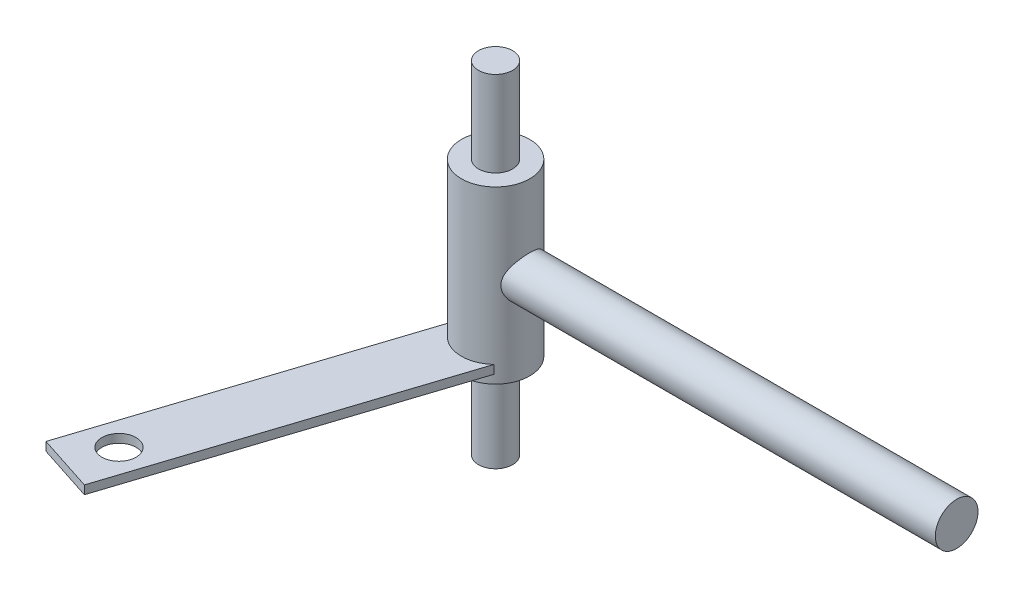
ISO-10303-21;
HEADER;
FILE_DESCRIPTION(('STEP AP214'),'2;1');
FILE_NAME('part.step','',(''),(''),'','','');
FILE_SCHEMA(('AUTOMOTIVE_DESIGN { 1 0 10303 214 1 1 1 1 }'));
ENDSEC;
DATA;
#1=APPLICATION_CONTEXT('core data for automotive mechanical design processes');
#2=APPLICATION_PROTOCOL_DEFINITION('international standard','automotive_design',2000,#1);
#3=PRODUCT_CONTEXT('',#1,'mechanical');
#4=PRODUCT('Part','Part','',(#3));
#5=PRODUCT_RELATED_PRODUCT_CATEGORY('part','',(#4));
#6=PRODUCT_DEFINITION_FORMATION('','',#4);
#7=PRODUCT_DEFINITION_CONTEXT('part definition',#1,'design');
#8=PRODUCT_DEFINITION('design','',#6,#7);
#9=PRODUCT_DEFINITION_SHAPE('','',#8);
#10=(LENGTH_UNIT() NAMED_UNIT(*) SI_UNIT(.MILLI.,.METRE.));
#11=(NAMED_UNIT(*) PLANE_ANGLE_UNIT() SI_UNIT($,.RADIAN.));
#12=(NAMED_UNIT(*) SI_UNIT($,.STERADIAN.) SOLID_ANGLE_UNIT());
#13=UNCERTAINTY_MEASURE_WITH_UNIT(LENGTH_MEASURE(1.E-05),#10,'distance_accuracy_value','');
#14=(GEOMETRIC_REPRESENTATION_CONTEXT(3) GLOBAL_UNCERTAINTY_ASSIGNED_CONTEXT((#13)) GLOBAL_UNIT_ASSIGNED_CONTEXT((#10,
#11,#12)) REPRESENTATION_CONTEXT('',''));
#15=CARTESIAN_POINT('',(0.,0.,0.));
#16=DIRECTION('',(0.,0.,1.));
#17=DIRECTION('',(1.,0.,0.));
#18=AXIS2_PLACEMENT_3D('',#15,#16,#17);
#19=CARTESIAN_POINT('',(0.,20.,0.));
#20=DIRECTION('',(0.,-1.,0.));
#21=DIRECTION('',(0.,0.,-1.));
#22=AXIS2_PLACEMENT_3D('',#19,#20,#21);
#23=CYLINDRICAL_SURFACE('',#22,8.);
#24=CARTESIAN_POINT('',(6.2449979983984,0.,5.));
#25=CARTESIAN_POINT('',(6.24499999083318,-0.124309997084916,4.99999874728376));
#26=CARTESIAN_POINT('',(6.24872594235153,-0.248643911922182,4.99535477639502));
#27=CARTESIAN_POINT('',(6.26346233698878,-0.49624234521784,4.97686385741702));
#28=CARTESIAN_POINT('',(6.27447707053879,-0.619506190474289,4.96301148892208));
#29=CARTESIAN_POINT('',(6.30332817855701,-0.864132894108489,4.92631685582622));
#30=CARTESIAN_POINT('',(6.32117831167981,-0.985491401070756,4.90345645667282));
#31=CARTESIAN_POINT('',(6.36295500797281,-1.22521846002732,4.84912073775945));
#32=CARTESIAN_POINT('',(6.38688460836052,-1.34358548492504,4.81764111134031));
#33=CARTESIAN_POINT('',(6.46598710467671,-1.69098285176997,4.7115563432738));
#34=CARTESIAN_POINT('',(6.52878844336903,-1.91472159134201,4.6249307188155));
#35=CARTESIAN_POINT('',(6.66732308206754,-2.34407629105235,4.42286683667302));
#36=CARTESIAN_POINT('',(6.74305673480881,-2.54969175663766,4.30742779304936));
#37=CARTESIAN_POINT('',(6.91118002626909,-2.9674414130167,4.03296948836377));
#38=CARTESIAN_POINT('',(7.00444112628932,-3.17674952950574,3.87018134056582));
#39=CARTESIAN_POINT('',(7.19012524520994,-3.5675602565304,3.51319765959103));
#40=CARTESIAN_POINT('',(7.28254746874407,-3.74903864049325,3.31897506071619));
#41=CARTESIAN_POINT('',(7.41988971846401,-4.00760626149244,2.99356128179164));
#42=CARTESIAN_POINT('',(7.46785190700925,-4.09554829341698,2.87212880091628));
#43=CARTESIAN_POINT('',(7.55971876275306,-4.2607595171728,2.62078661715024));
#44=CARTESIAN_POINT('',(7.60362512973126,-4.33803318685166,2.49088050482952));
#45=CARTESIAN_POINT('',(7.68611478127736,-4.48104536831486,2.22333771815377));
#46=CARTESIAN_POINT('',(7.72470066932016,-4.54678952615798,2.08570487145723));
#47=CARTESIAN_POINT('',(7.79539753077303,-4.66588913640084,1.80358193532003));
#48=CARTESIAN_POINT('',(7.82750968154027,-4.71924684175159,1.6590930986712));
#49=CARTESIAN_POINT('',(7.88132879110577,-4.8079574186921,1.37943032429723));
#50=CARTESIAN_POINT('',(7.90376135583819,-4.84458864196752,1.24480106420069));
#51=CARTESIAN_POINT('',(7.94191844310852,-4.90659427549434,0.972050692903698));
#52=CARTESIAN_POINT('',(7.95764407963578,-4.93197055516711,0.833930165626438));
#53=CARTESIAN_POINT('',(7.98191012055643,-4.97102838824165,0.555534462309618));
#54=CARTESIAN_POINT('',(7.9904564434862,-4.98471957483722,0.415261158337185));
#55=CARTESIAN_POINT('',(8.00011955525847,-5.00019508535282,0.133810084943768));
#56=CARTESIAN_POINT('',(8.00123719925945,-5.00198077978344,-0.00736757849820934));
#57=CARTESIAN_POINT('',(7.99636544353032,-4.99418306842006,-0.270239609899376));
#58=CARTESIAN_POINT('',(7.99131217584322,-4.9860972278415,-0.391999310072934));
#59=CARTESIAN_POINT('',(7.97573898833036,-4.96109950689231,-0.63429359230614));
#60=CARTESIAN_POINT('',(7.96521743178982,-4.94418498400023,-0.754827796543429));
#61=CARTESIAN_POINT('',(7.93894787928476,-4.90175195667388,-0.9937504162903));
#62=CARTESIAN_POINT('',(7.92320165200919,-4.8762363638823,-1.11213954368103));
#63=CARTESIAN_POINT('',(7.88683283084566,-4.81691536004192,-1.34607315554106));
#64=CARTESIAN_POINT('',(7.86620835217571,-4.78310674467799,-1.46161652141072));
#65=CARTESIAN_POINT('',(7.79753837345255,-4.66961406787293,-1.80341623892686));
#66=CARTESIAN_POINT('',(7.74273886956257,-4.57793007291278,-2.02447250488061));
#67=CARTESIAN_POINT('',(7.6194209119633,-4.36611560771666,-2.44811588786114));
#68=CARTESIAN_POINT('',(7.55089933332867,-4.24597865675437,-2.6506987826293));
#69=CARTESIAN_POINT('',(7.39573414184525,-3.96389668023518,-3.05883635403528));
#70=CARTESIAN_POINT('',(7.30789649394851,-3.79860933546551,-3.26162345770391));
#71=CARTESIAN_POINT('',(7.12780216070677,-3.43944259665051,-3.63842034253163));
#72=CARTESIAN_POINT('',(7.0355391870356,-3.24552165003414,-3.81238750882611));
#73=CARTESIAN_POINT('',(6.89398778931581,-2.92199806035766,-4.05999923159469));
#74=CARTESIAN_POINT('',(6.84343529038729,-2.80103153254676,-4.14440430037547));
#75=CARTESIAN_POINT('',(6.7450499014227,-2.5512511400869,-4.30267035241461));
#76=CARTESIAN_POINT('',(6.69721752335299,-2.42243580756731,-4.37652935467605));
#77=CARTESIAN_POINT('',(6.60608014442446,-2.15770926568204,-4.51291782494085));
#78=CARTESIAN_POINT('',(6.56276754252838,-2.02181056536115,-4.57546644816391));
#79=CARTESIAN_POINT('',(6.48238923774268,-1.74330768244433,-4.6886516739402));
#80=CARTESIAN_POINT('',(6.44532349757936,-1.60070353986484,-4.7392883475702));
#81=CARTESIAN_POINT('',(6.3879911088914,-1.34808415551627,-4.81614194168603));
#82=CARTESIAN_POINT('',(6.36587062744548,-1.23937010533179,-4.84527833481626));
#83=CARTESIAN_POINT('',(6.3267200135842,-1.01935900201234,-4.89628944573215));
#84=CARTESIAN_POINT('',(6.30968872571675,-0.908062541381968,-4.91816581196151));
#85=CARTESIAN_POINT('',(6.2813224765214,-0.683654493148006,-4.95434333722363));
#86=CARTESIAN_POINT('',(6.26998098512218,-0.570545140796211,-4.96865318123363));
#87=CARTESIAN_POINT('',(6.25339132178237,-0.343158274667134,-4.98951663397229));
#88=CARTESIAN_POINT('',(6.24814339794355,-0.228880713516906,-4.99606992689043));
#89=CARTESIAN_POINT('',(6.24394563972607,0.000213756327469843,-5.00131530513999));
#90=CARTESIAN_POINT('',(6.2450091194138,0.115031294285455,-4.99999077198392));
#91=CARTESIAN_POINT('',(6.25342323341975,0.34411058983996,-4.98946310366481));
#92=CARTESIAN_POINT('',(6.26077617711313,0.458372127783275,-4.98025707456074));
#93=CARTESIAN_POINT('',(6.28148941326477,0.685492435641885,-4.95410620951325));
#94=CARTESIAN_POINT('',(6.29485173090555,0.798350719467862,-4.9371587646522));
#95=CARTESIAN_POINT('',(6.32708655414446,1.02190368194708,-4.8957794498311));
#96=CARTESIAN_POINT('',(6.3459613393153,1.13259744525952,-4.87134448334739));
#97=CARTESIAN_POINT('',(6.40919739263554,1.45674114316006,-4.78821642821574));
#98=CARTESIAN_POINT('',(6.46057720915498,1.6662777271024,-4.71921780239627));
#99=CARTESIAN_POINT('',(6.57662484324882,2.07118631830434,-4.55609149726001));
#100=CARTESIAN_POINT('',(6.6412973751829,2.26655326684989,-4.46195489902188));
#101=CARTESIAN_POINT('',(6.79148506979738,2.67720575477837,-4.23062377482239));
#102=CARTESIAN_POINT('',(6.87862419429458,2.88920195195314,-4.08864375810928));
#103=CARTESIAN_POINT('',(7.05576916354209,3.28876845285956,-3.77473221644168));
#104=CARTESIAN_POINT('',(7.14577790264,3.47631305761312,-3.60276961587649));
#105=CARTESIAN_POINT('',(7.28444679190235,3.75109437385404,-3.30924585333197));
#106=CARTESIAN_POINT('',(7.3346230901993,3.84742308399405,-3.19677534649598));
#107=CARTESIAN_POINT('',(7.43214539316412,4.03023211498251,-2.96297696798608));
#108=CARTESIAN_POINT('',(7.47949245970999,4.11671614194503,-2.84165245789285));
#109=CARTESIAN_POINT('',(7.57009743381039,4.27912544276188,-2.59064393379972));
#110=CARTESIAN_POINT('',(7.61335451021155,4.35504857193848,-2.46095822963468));
#111=CARTESIAN_POINT('',(7.69452475176042,4.49544110368957,-2.19402109584822));
#112=CARTESIAN_POINT('',(7.73244126265916,4.55991768393769,-2.05677447863483));
#113=CARTESIAN_POINT('',(7.79976180045409,4.67313922374355,-1.78389488579443));
#114=CARTESIAN_POINT('',(7.82953658856128,4.72258893611767,-1.64864631402092));
#115=CARTESIAN_POINT('',(7.88249738910155,4.80988250173737,-1.37327166975237));
#116=CARTESIAN_POINT('',(7.90568721484267,4.84773307297854,-1.2331484731144));
#117=CARTESIAN_POINT('',(7.94476970960063,4.91121075887916,-0.949284871547718));
#118=CARTESIAN_POINT('',(7.96066874338032,4.93684853590452,-0.805547737630325));
#119=CARTESIAN_POINT('',(7.98468098207153,4.97547600812264,-0.515747890604359));
#120=CARTESIAN_POINT('',(7.99279547496114,4.98846779564148,-0.369685566273095));
#121=CARTESIAN_POINT('',(8.00036899836203,5.0005918204771,-0.0984542398463481));
#122=CARTESIAN_POINT('',(8.00093085905799,5.00148999709849,0.0266091901107878));
#123=CARTESIAN_POINT('',(7.99619997327325,4.99391869226614,0.276384426548502));
#124=CARTESIAN_POINT('',(7.99090543949389,4.98544635104714,0.401096114033592));
#125=CARTESIAN_POINT('',(7.97459103015405,4.95925462589747,0.649105048465708));
#126=CARTESIAN_POINT('',(7.96357367253312,4.9415393086947,0.772402893113274));
#127=CARTESIAN_POINT('',(7.93607401526798,4.89709863543925,1.01678782002796));
#128=CARTESIAN_POINT('',(7.91958960822669,4.87036980485838,1.13787403075122));
#129=CARTESIAN_POINT('',(7.88220417715129,4.80933512611737,1.3727696067634));
#130=CARTESIAN_POINT('',(7.86147899328625,4.77532902296419,1.486685097437));
#131=CARTESIAN_POINT('',(7.8157172820285,4.69961071566991,1.71105112688166));
#132=CARTESIAN_POINT('',(7.79067928081094,4.65789587685613,1.82150046585626));
#133=CARTESIAN_POINT('',(7.70981708144695,4.52179700785277,2.14674322952902));
#134=CARTESIAN_POINT('',(7.64821482975006,4.41641101660221,2.3556119089249));
#135=CARTESIAN_POINT('',(7.50700801995937,4.1673460340312,2.77466231937412));
#136=CARTESIAN_POINT('',(7.42619858107808,4.02082779517783,2.98273013480178));
#137=CARTESIAN_POINT('',(7.2573471375721,3.6996977630728,3.37285679634255));
#138=CARTESIAN_POINT('',(7.16929702745266,3.52505426989102,3.55488585185797));
#139=CARTESIAN_POINT('',(6.98001614835192,3.12352869133323,3.91489797533942));
#140=CARTESIAN_POINT('',(6.87871489286988,2.89274538552561,4.08851588919805));
#141=CARTESIAN_POINT('',(6.68699282488335,2.40144255795418,4.3950903074783));
#142=CARTESIAN_POINT('',(6.59656601160477,2.14093959230367,4.52806930044201));
#143=CARTESIAN_POINT('',(6.45719150743099,1.65432760274299,4.72397005512007));
#144=CARTESIAN_POINT('',(6.40349524541685,1.43325185965496,4.79586701428079));
#145=CARTESIAN_POINT('',(6.33898756748728,1.09324362690463,4.88041603953431));
#146=CARTESIAN_POINT('',(6.32016868842665,0.978627920072953,4.90470355408434));
#147=CARTESIAN_POINT('',(6.28849738412123,0.747193668970045,4.94524770814465));
#148=CARTESIAN_POINT('',(6.27564188891545,0.630376290428755,4.9615084801139));
#149=CARTESIAN_POINT('',(6.25906589814134,0.427895086979101,4.9823903295282));
#150=CARTESIAN_POINT('',(6.25380210027526,0.342553322442731,4.98898701036639));
#151=CARTESIAN_POINT('',(6.24676702410079,0.171478227136942,4.99779282932784));
#152=CARTESIAN_POINT('',(6.24499662408473,0.0857448033275004,5.00000086408101));
#153=CARTESIAN_POINT('',(6.2449979983984,0.,5.));
#154=B_SPLINE_CURVE_WITH_KNOTS('',3,(#24,#25,#26,#27,#28,#29,#30,#31,#32,#33,#34,#35,#36,#37,
#38,#39,#40,#41,#42,#43,#44,#45,#46,#47,#48,#49,#50,#51,#52,#53,#54,#55,#56,#57,#58,#59,#60,#61,
#62,#63,#64,#65,#66,#67,#68,#69,#70,#71,#72,#73,#74,#75,#76,#77,#78,#79,#80,#81,#82,#83,#84,#85,
#86,#87,#88,#89,#90,#91,#92,#93,#94,#95,#96,#97,#98,#99,#100,#101,#102,#103,#104,#105,#106,#107,
#108,#109,#110,#111,#112,#113,#114,#115,#116,#117,#118,#119,#120,#121,#122,#123,#124,#125,#126,
#127,#128,#129,#130,#131,#132,#133,#134,#135,#136,#137,#138,#139,#140,#141,#142,#143,#144,#145,
#146,#147,#148,#149,#150,#151,#152,#153),.UNSPECIFIED.,.T.,.F.,(4,2,2,2,2,2,2,2,2,2,2,2,2,2,2,2,
2,2,2,2,2,2,2,2,2,2,2,2,2,2,2,2,2,2,2,2,2,2,2,2,2,2,2,2,2,2,2,2,2,2,2,2,2,2,2,2,2,2,2,2,2,2,2,2,
4),(0.,0.372830631717394,0.745880919988992,1.11968608457865,1.49367836553752,2.2343739724708,
2.97508978546025,3.81517657771247,4.65599058786117,5.1276972709508,5.59920535801266,
6.0704818965238,6.54167264805615,6.9650003716167,7.38825775501684,7.8111658669397,
8.2340252946041,8.59998197802636,8.96604825916241,9.33199074341863,9.69807484639391,
10.4313641163756,11.1648205684642,11.9895533165928,12.8154948839412,13.2827866246025,
13.7501660272479,14.2167463086997,14.6833238060682,15.0271003394338,15.3707987622619,
15.7141018213498,16.0574188576537,16.4014603870609,16.7456282964257,17.0899122787371,
17.4343388350078,18.1111129623981,18.7881275281776,19.5940378131019,20.4007884080993,
20.8693475683427,21.337729748067,21.8062069071061,22.2743892571628,22.7148894158782,
23.1551339612148,23.5949934439159,24.0347801378503,24.409509228706,24.7843527137741,
25.1590314139736,25.5338547106938,25.8954875601863,26.2572442370256,26.9801965139639,
27.7781872367985,28.5770837508034,29.4911341692987,30.4046778558642,31.1173375632652,
31.472952845656,31.8283848529182,32.0854860972178,32.3426519723746),.UNSPECIFIED.);
#155=CARTESIAN_POINT('',(6.2449979983984,0.,5.));
#156=VERTEX_POINT('',#155);
#157=EDGE_CURVE('E124',#156,#156,#154,.T.);
#158=ORIENTED_EDGE('',*,*,#157,.F.);
#159=EDGE_LOOP('',(#158));
#160=FACE_BOUND('',#159,.T.);
#161=CARTESIAN_POINT('',(0.,-20.,0.));
#162=DIRECTION('',(0.,1.,0.));
#163=DIRECTION('',(0.,0.,1.));
#164=AXIS2_PLACEMENT_3D('',#161,#162,#163);
#165=CIRCLE('',#164,8.);
#166=CARTESIAN_POINT('',(0.,-20.,8.));
#167=VERTEX_POINT('',#166);
#168=EDGE_CURVE('E103',#167,#167,#165,.T.);
#169=ORIENTED_EDGE('',*,*,#168,.T.);
#170=EDGE_LOOP('',(#169));
#171=FACE_BOUND('',#170,.T.);
#172=CARTESIAN_POINT('',(0.,20.,0.));
#173=DIRECTION('',(0.,1.,0.));
#174=DIRECTION('',(0.,0.,1.));
#175=AXIS2_PLACEMENT_3D('',#172,#173,#174);
#176=CIRCLE('',#175,8.);
#177=CARTESIAN_POINT('',(0.,20.,8.));
#178=VERTEX_POINT('',#177);
#179=EDGE_CURVE('E109',#178,#178,#176,.T.);
#180=ORIENTED_EDGE('',*,*,#179,.F.);
#181=EDGE_LOOP('',(#180));
#182=FACE_BOUND('',#181,.T.);
#183=DIRECTION('',(0.,-1.,0.));
#184=VECTOR('',#183,1.);
#185=CARTESIAN_POINT('',(5.46057794115684,20.,5.8465450095378));
#186=LINE('',#185,#184);
#187=CARTESIAN_POINT('',(5.46057794115684,-18.,5.8465450095378));
#188=VERTEX_POINT('',#187);
#189=CARTESIAN_POINT('',(5.46057794115684,-16.,5.8465450095378));
#190=VERTEX_POINT('',#189);
#191=EDGE_CURVE('E11',#188,#190,#186,.F.);
#192=ORIENTED_EDGE('',*,*,#191,.F.);
#193=CARTESIAN_POINT('',(0.,-18.,0.));
#194=DIRECTION('',(0.,1.,0.));
#195=DIRECTION('',(0.,0.,1.));
#196=AXIS2_PLACEMENT_3D('',#193,#194,#195);
#197=CIRCLE('',#196,8.);
#198=CARTESIAN_POINT('',(-7.85421328697531,-18.,1.52030708828855));
#199=VERTEX_POINT('',#198);
#200=EDGE_CURVE('E134',#199,#188,#197,.T.);
#201=ORIENTED_EDGE('',*,*,#200,.F.);
#202=DIRECTION('',(0.,-1.,0.));
#203=VECTOR('',#202,1.);
#204=CARTESIAN_POINT('',(-7.85421328697531,20.,1.52030708828855));
#205=LINE('',#204,#203);
#206=CARTESIAN_POINT('',(-7.85421328697531,-16.,1.52030708828855));
#207=VERTEX_POINT('',#206);
#208=EDGE_CURVE('E59',#207,#199,#205,.T.);
#209=ORIENTED_EDGE('',*,*,#208,.F.);
#210=CARTESIAN_POINT('',(0.,-16.,0.));
#211=DIRECTION('',(0.,-1.,0.));
#212=DIRECTION('',(1.,0.,0.));
#213=AXIS2_PLACEMENT_3D('',#210,#211,#212);
#214=CIRCLE('',#213,8.);
#215=EDGE_CURVE('E49',#190,#207,#214,.T.);
#216=ORIENTED_EDGE('',*,*,#215,.F.);
#217=EDGE_LOOP('',(#192,#201,#209,#216));
#218=FACE_BOUND('',#217,.T.);
#219=ADVANCED_FACE('F41',(#160,#171,#182,#218),#23,.T.);
#220=CARTESIAN_POINT('',(0.,40.,0.));
#221=DIRECTION('',(0.,-1.,0.));
#222=DIRECTION('',(0.,0.,-1.));
#223=AXIS2_PLACEMENT_3D('',#220,#221,#222);
#224=CYLINDRICAL_SURFACE('',#223,4.);
#225=CARTESIAN_POINT('',(0.,20.,0.));
#226=DIRECTION('',(0.,1.,0.));
#227=DIRECTION('',(0.,0.,1.));
#228=AXIS2_PLACEMENT_3D('',#225,#226,#227);
#229=CIRCLE('',#228,4.);
#230=CARTESIAN_POINT('',(0.,20.,4.));
#231=VERTEX_POINT('',#230);
#232=EDGE_CURVE('E112',#231,#231,#229,.T.);
#233=ORIENTED_EDGE('',*,*,#232,.T.);
#234=EDGE_LOOP('',(#233));
#235=FACE_BOUND('',#234,.T.);
#236=CARTESIAN_POINT('',(0.,40.,0.));
#237=DIRECTION('',(0.,1.,0.));
#238=DIRECTION('',(0.,0.,1.));
#239=AXIS2_PLACEMENT_3D('',#236,#237,#238);
#240=CIRCLE('',#239,4.);
#241=CARTESIAN_POINT('',(0.,40.,4.));
#242=VERTEX_POINT('',#241);
#243=EDGE_CURVE('E115',#242,#242,#240,.T.);
#244=ORIENTED_EDGE('',*,*,#243,.F.);
#245=EDGE_LOOP('',(#244));
#246=FACE_BOUND('',#245,.T.);
#247=ADVANCED_FACE('F43',(#235,#246),#224,.T.);
#248=CARTESIAN_POINT('',(0.,40.,0.));
#249=DIRECTION('',(0.,1.,0.));
#250=DIRECTION('',(0.,0.,1.));
#251=AXIS2_PLACEMENT_3D('',#248,#249,#250);
#252=PLANE('',#251);
#253=ORIENTED_EDGE('',*,*,#243,.T.);
#254=EDGE_LOOP('',(#253));
#255=FACE_BOUND('',#254,.T.);
#256=ADVANCED_FACE('F151',(#255),#252,.T.);
#257=CARTESIAN_POINT('',(0.,20.,0.));
#258=DIRECTION('',(0.,1.,0.));
#259=DIRECTION('',(0.,0.,1.));
#260=AXIS2_PLACEMENT_3D('',#257,#258,#259);
#261=PLANE('',#260);
#262=ORIENTED_EDGE('',*,*,#232,.F.);
#263=EDGE_LOOP('',(#262));
#264=FACE_BOUND('',#263,.T.);
#265=ORIENTED_EDGE('',*,*,#179,.T.);
#266=EDGE_LOOP('',(#265));
#267=FACE_BOUND('',#266,.T.);
#268=ADVANCED_FACE('F148',(#264,#267),#261,.T.);
#269=CARTESIAN_POINT('',(0.,-20.,0.));
#270=DIRECTION('',(0.,1.,0.));
#271=DIRECTION('',(0.,0.,1.));
#272=AXIS2_PLACEMENT_3D('',#269,#270,#271);
#273=PLANE('',#272);
#274=CARTESIAN_POINT('',(0.,-20.,0.));
#275=DIRECTION('',(0.,1.,0.));
#276=DIRECTION('',(0.,0.,1.));
#277=AXIS2_PLACEMENT_3D('',#274,#275,#276);
#278=CIRCLE('',#277,4.);
#279=CARTESIAN_POINT('',(0.,-20.,4.));
#280=VERTEX_POINT('',#279);
#281=EDGE_CURVE('E118',#280,#280,#278,.T.);
#282=ORIENTED_EDGE('',*,*,#281,.T.);
#283=EDGE_LOOP('',(#282));
#284=FACE_BOUND('',#283,.T.);
#285=ORIENTED_EDGE('',*,*,#168,.F.);
#286=EDGE_LOOP('',(#285));
#287=FACE_BOUND('',#286,.T.);
#288=ADVANCED_FACE('F150',(#284,#287),#273,.F.);
#289=CARTESIAN_POINT('',(0.,-40.,0.));
#290=DIRECTION('',(0.,1.,0.));
#291=DIRECTION('',(0.,0.,1.));
#292=AXIS2_PLACEMENT_3D('',#289,#290,#291);
#293=PLANE('',#292);
#294=CARTESIAN_POINT('',(0.,-40.,0.));
#295=DIRECTION('',(0.,1.,0.));
#296=DIRECTION('',(0.,0.,1.));
#297=AXIS2_PLACEMENT_3D('',#294,#295,#296);
#298=CIRCLE('',#297,4.);
#299=CARTESIAN_POINT('',(0.,-40.,4.));
#300=VERTEX_POINT('',#299);
#301=EDGE_CURVE('E119',#300,#300,#298,.T.);
#302=ORIENTED_EDGE('',*,*,#301,.F.);
#303=EDGE_LOOP('',(#302));
#304=FACE_BOUND('',#303,.T.);
#305=ADVANCED_FACE('F154',(#304),#293,.F.);
#306=ORIENTED_EDGE('',*,*,#301,.T.);
#307=EDGE_LOOP('',(#306));
#308=FACE_BOUND('',#307,.T.);
#309=ORIENTED_EDGE('',*,*,#281,.F.);
#310=EDGE_LOOP('',(#309));
#311=FACE_BOUND('',#310,.T.);
#312=ADVANCED_FACE('F145',(#308,#311),#224,.T.);
#313=CARTESIAN_POINT('',(108.,0.,0.));
#314=DIRECTION('',(-1.,0.,0.));
#315=DIRECTION('',(0.,0.,1.));
#316=AXIS2_PLACEMENT_3D('',#313,#314,#315);
#317=CYLINDRICAL_SURFACE('',#316,5.);
#318=CARTESIAN_POINT('',(108.,0.,0.));
#319=DIRECTION('',(1.,0.,0.));
#320=DIRECTION('',(0.,0.,-1.));
#321=AXIS2_PLACEMENT_3D('',#318,#319,#320);
#322=CIRCLE('',#321,5.);
#323=CARTESIAN_POINT('',(108.,0.,-5.));
#324=VERTEX_POINT('',#323);
#325=EDGE_CURVE('E100',#324,#324,#322,.T.);
#326=ORIENTED_EDGE('',*,*,#325,.F.);
#327=EDGE_LOOP('',(#326));
#328=FACE_BOUND('',#327,.T.);
#329=ORIENTED_EDGE('',*,*,#157,.T.);
#330=EDGE_LOOP('',(#329));
#331=FACE_BOUND('',#330,.T.);
#332=ADVANCED_FACE('F139',(#328,#331),#317,.T.);
#333=CARTESIAN_POINT('',(108.,0.,0.));
#334=DIRECTION('',(1.,0.,0.));
#335=DIRECTION('',(0.,0.,-1.));
#336=AXIS2_PLACEMENT_3D('',#333,#334,#335);
#337=PLANE('',#336);
#338=ORIENTED_EDGE('',*,*,#325,.T.);
#339=EDGE_LOOP('',(#338));
#340=FACE_BOUND('',#339,.T.);
#341=ADVANCED_FACE('F144',(#340),#337,.T.);
#342=CARTESIAN_POINT('',(-18.0639639359298,-16.,78.2476402642369));
#343=DIRECTION('',(-0.951056516295153,0.,-0.309016994374948));
#344=DIRECTION('',(-0.309016994374948,0.,0.951056516295153));
#345=AXIS2_PLACEMENT_3D('',#342,#343,#344);
#346=PLANE('',#345);
#347=DIRECTION('',(0.309016994374948,0.,-0.951056516295153));
#348=VECTOR('',#347,1.);
#349=CARTESIAN_POINT('',(-18.0639639359298,-18.,78.2476402642369));
#350=LINE('',#349,#348);
#351=CARTESIAN_POINT('',(-18.0639639359298,-18.,78.2476402642369));
#352=VERTEX_POINT('',#351);
#353=EDGE_CURVE('E179',#352,#188,#350,.T.);
#354=ORIENTED_EDGE('',*,*,#353,.T.);
#355=ORIENTED_EDGE('',*,*,#191,.T.);
#356=DIRECTION('',(0.309016994374948,0.,-0.951056516295153));
#357=VECTOR('',#356,1.);
#358=CARTESIAN_POINT('',(-18.0639639359298,-16.,78.2476402642369));
#359=LINE('',#358,#357);
#360=CARTESIAN_POINT('',(-18.0639639359298,-16.,78.2476402642369));
#361=VERTEX_POINT('',#360);
#362=EDGE_CURVE('E82',#361,#190,#359,.T.);
#363=ORIENTED_EDGE('',*,*,#362,.F.);
#364=DIRECTION('',(0.,1.,0.));
#365=VECTOR('',#364,1.);
#366=CARTESIAN_POINT('',(-18.0639639359298,-16.,78.2476402642369));
#367=LINE('',#366,#365);
#368=EDGE_CURVE('E88',#352,#361,#367,.T.);
#369=ORIENTED_EDGE('',*,*,#368,.F.);
#370=EDGE_LOOP('',(#354,#355,#363,#369));
#371=FACE_BOUND('',#370,.T.);
#372=ADVANCED_FACE('F99',(#371),#346,.F.);
#373=CARTESIAN_POINT('',(-31.3787551640619,-16.,73.9214023429876));
#374=DIRECTION('',(0.951056516295153,0.,0.309016994374948));
#375=DIRECTION('',(0.309016994374948,0.,-0.951056516295153));
#376=AXIS2_PLACEMENT_3D('',#373,#374,#375);
#377=PLANE('',#376);
#378=DIRECTION('',(0.309016994374948,0.,-0.951056516295153));
#379=VECTOR('',#378,1.);
#380=CARTESIAN_POINT('',(-31.3787551640619,-16.,73.9214023429876));
#381=LINE('',#380,#379);
#382=CARTESIAN_POINT('',(-31.3787551640619,-16.,73.9214023429876));
#383=VERTEX_POINT('',#382);
#384=EDGE_CURVE('E84',#383,#207,#381,.T.);
#385=ORIENTED_EDGE('',*,*,#384,.T.);
#386=ORIENTED_EDGE('',*,*,#208,.T.);
#387=DIRECTION('',(0.309016994374948,0.,-0.951056516295153));
#388=VECTOR('',#387,1.);
#389=CARTESIAN_POINT('',(-31.3787551640619,-18.,73.9214023429876));
#390=LINE('',#389,#388);
#391=CARTESIAN_POINT('',(-31.3787551640619,-18.,73.9214023429876));
#392=VERTEX_POINT('',#391);
#393=EDGE_CURVE('E105',#392,#199,#390,.T.);
#394=ORIENTED_EDGE('',*,*,#393,.F.);
#395=DIRECTION('',(0.,-1.,0.));
#396=VECTOR('',#395,1.);
#397=CARTESIAN_POINT('',(-31.3787551640619,-16.,73.9214023429876));
#398=LINE('',#397,#396);
#399=EDGE_CURVE('E87',#383,#392,#398,.T.);
#400=ORIENTED_EDGE('',*,*,#399,.F.);
#401=EDGE_LOOP('',(#385,#386,#394,#400));
#402=FACE_BOUND('',#401,.T.);
#403=ADVANCED_FACE('F195',(#402),#377,.F.);
#404=CARTESIAN_POINT('',(-31.3787551640619,-16.,73.9214023429876));
#405=DIRECTION('',(0.,-1.,0.));
#406=DIRECTION('',(1.,0.,0.));
#407=AXIS2_PLACEMENT_3D('',#404,#405,#406);
#408=PLANE('',#407);
#409=CARTESIAN_POINT('',(-21.6311896062464,-16.,66.5739561406608));
#410=DIRECTION('',(0.,1.,0.));
#411=DIRECTION('',(-1.,0.,0.));
#412=AXIS2_PLACEMENT_3D('',#409,#410,#411);
#413=CIRCLE('',#412,4.00000000000001);
#414=CARTESIAN_POINT('',(-25.6311896062464,-16.,66.5739561406608));
#415=VERTEX_POINT('',#414);
#416=EDGE_CURVE('E187',#415,#415,#413,.T.);
#417=ORIENTED_EDGE('',*,*,#416,.F.);
#418=EDGE_LOOP('',(#417));
#419=FACE_BOUND('',#418,.T.);
#420=ORIENTED_EDGE('',*,*,#362,.T.);
#421=ORIENTED_EDGE('',*,*,#215,.T.);
#422=ORIENTED_EDGE('',*,*,#384,.F.);
#423=DIRECTION('',(-0.951056516295153,0.,-0.309016994374948));
#424=VECTOR('',#423,1.);
#425=CARTESIAN_POINT('',(-31.3787551640619,-16.,73.9214023429876));
#426=LINE('',#425,#424);
#427=EDGE_CURVE('E78',#361,#383,#426,.T.);
#428=ORIENTED_EDGE('',*,*,#427,.F.);
#429=EDGE_LOOP('',(#420,#421,#422,#428));
#430=FACE_BOUND('',#429,.T.);
#431=ADVANCED_FACE('F80',(#419,#430),#408,.F.);
#432=CARTESIAN_POINT('',(-31.3787551640619,-18.,73.9214023429876));
#433=DIRECTION('',(0.,1.,0.));
#434=DIRECTION('',(0.,0.,1.));
#435=AXIS2_PLACEMENT_3D('',#432,#433,#434);
#436=PLANE('',#435);
#437=CARTESIAN_POINT('',(-21.6311896062464,-18.,66.5739561406608));
#438=DIRECTION('',(0.,1.,0.));
#439=DIRECTION('',(0.,0.,1.));
#440=AXIS2_PLACEMENT_3D('',#437,#438,#439);
#441=CIRCLE('',#440,4.00000000000001);
#442=CARTESIAN_POINT('',(-21.6311896062464,-18.,70.5739561406608));
#443=VERTEX_POINT('',#442);
#444=EDGE_CURVE('E97',#443,#443,#441,.F.);
#445=ORIENTED_EDGE('',*,*,#444,.F.);
#446=EDGE_LOOP('',(#445));
#447=FACE_BOUND('',#446,.T.);
#448=ORIENTED_EDGE('',*,*,#393,.T.);
#449=ORIENTED_EDGE('',*,*,#200,.T.);
#450=ORIENTED_EDGE('',*,*,#353,.F.);
#451=DIRECTION('',(0.951056516295153,0.,0.309016994374948));
#452=VECTOR('',#451,1.);
#453=CARTESIAN_POINT('',(-31.3787551640619,-18.,73.9214023429876));
#454=LINE('',#453,#452);
#455=EDGE_CURVE('E93',#392,#352,#454,.T.);
#456=ORIENTED_EDGE('',*,*,#455,.F.);
#457=EDGE_LOOP('',(#448,#449,#450,#456));
#458=FACE_BOUND('',#457,.T.);
#459=ADVANCED_FACE('F178',(#447,#458),#436,.F.);
#460=CARTESIAN_POINT('',(-24.7213595499959,0.,76.0845213036123));
#461=DIRECTION('',(-0.309016994374948,0.,0.951056516295154));
#462=DIRECTION('',(0.951056516295154,0.,0.309016994374948));
#463=AXIS2_PLACEMENT_3D('',#460,#461,#462);
#464=PLANE('',#463);
#465=ORIENTED_EDGE('',*,*,#368,.T.);
#466=ORIENTED_EDGE('',*,*,#427,.T.);
#467=ORIENTED_EDGE('',*,*,#399,.T.);
#468=ORIENTED_EDGE('',*,*,#455,.T.);
#469=EDGE_LOOP('',(#465,#466,#467,#468));
#470=FACE_BOUND('',#469,.T.);
#471=ADVANCED_FACE('F91',(#470),#464,.T.);
#472=CARTESIAN_POINT('',(-21.6311896062464,-40.001,66.5739561406608));
#473=DIRECTION('',(0.,1.,0.));
#474=DIRECTION('',(-1.,0.,0.));
#475=AXIS2_PLACEMENT_3D('',#472,#473,#474);
#476=CYLINDRICAL_SURFACE('',#475,4.00000000000001);
#477=ORIENTED_EDGE('',*,*,#416,.T.);
#478=EDGE_LOOP('',(#477));
#479=FACE_BOUND('',#478,.T.);
#480=ORIENTED_EDGE('',*,*,#444,.T.);
#481=EDGE_LOOP('',(#480));
#482=FACE_BOUND('',#481,.T.);
#483=ADVANCED_FACE('F191',(#479,#482),#476,.F.);
#484=CLOSED_SHELL('',(#219,#247,#256,#268,#288,#305,#312,#332,#341,#372,#403,#431,#459,#471,#483));
#485=MANIFOLD_SOLID_BREP('B2',#484);
#486=ADVANCED_BREP_SHAPE_REPRESENTATION('',(#18,#485),#14);
#487=SHAPE_DEFINITION_REPRESENTATION(#9,#486);
ENDSEC;
END-ISO-10303-21;
